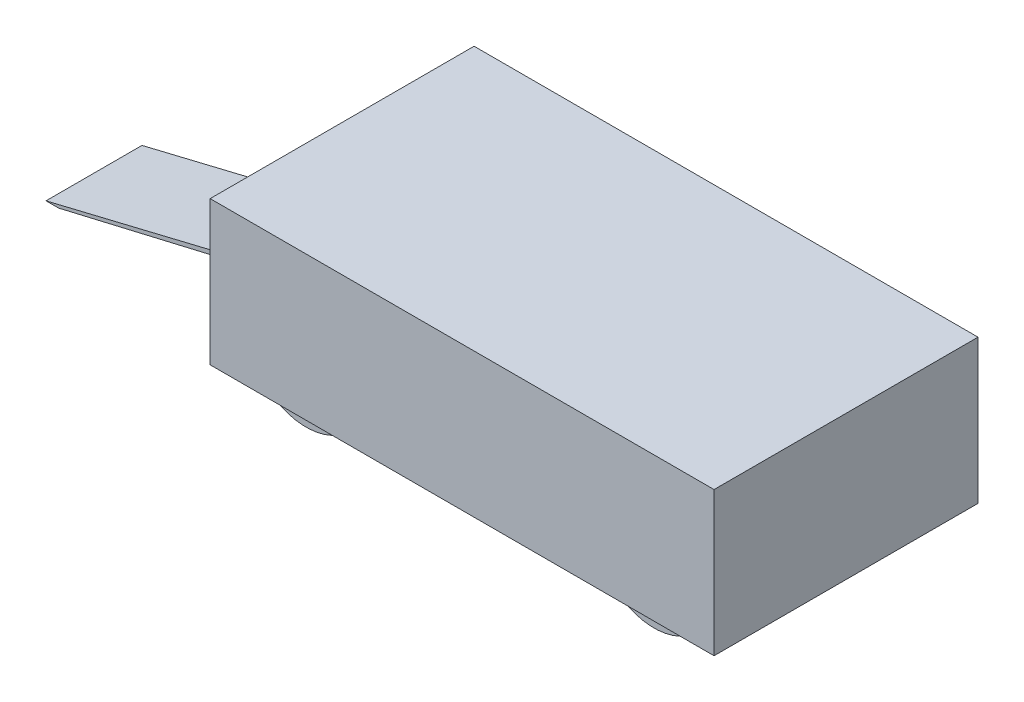
ISO-10303-21;
HEADER;
FILE_DESCRIPTION(('STEP AP214'),'2;1');
FILE_NAME('part.step','',(''),(''),'','','');
FILE_SCHEMA(('AUTOMOTIVE_DESIGN { 1 0 10303 214 1 1 1 1 }'));
ENDSEC;
DATA;
#1=APPLICATION_CONTEXT('core data for automotive mechanical design processes');
#2=APPLICATION_PROTOCOL_DEFINITION('international standard','automotive_design',2000,#1);
#3=PRODUCT_CONTEXT('',#1,'mechanical');
#4=PRODUCT('Part','Part','',(#3));
#5=PRODUCT_RELATED_PRODUCT_CATEGORY('part','',(#4));
#6=PRODUCT_DEFINITION_FORMATION('','',#4);
#7=PRODUCT_DEFINITION_CONTEXT('part definition',#1,'design');
#8=PRODUCT_DEFINITION('design','',#6,#7);
#9=PRODUCT_DEFINITION_SHAPE('','',#8);
#10=(LENGTH_UNIT() NAMED_UNIT(*) SI_UNIT(.MILLI.,.METRE.));
#11=(NAMED_UNIT(*) PLANE_ANGLE_UNIT() SI_UNIT($,.RADIAN.));
#12=(NAMED_UNIT(*) SI_UNIT($,.STERADIAN.) SOLID_ANGLE_UNIT());
#13=UNCERTAINTY_MEASURE_WITH_UNIT(LENGTH_MEASURE(1.E-05),#10,'distance_accuracy_value','');
#14=(GEOMETRIC_REPRESENTATION_CONTEXT(3) GLOBAL_UNCERTAINTY_ASSIGNED_CONTEXT((#13)) GLOBAL_UNIT_ASSIGNED_CONTEXT((#10,
#11,#12)) REPRESENTATION_CONTEXT('',''));
#15=CARTESIAN_POINT('',(0.,0.,0.));
#16=DIRECTION('',(0.,0.,1.));
#17=DIRECTION('',(1.,0.,0.));
#18=AXIS2_PLACEMENT_3D('',#15,#16,#17);
#19=CARTESIAN_POINT('',(0.,0.,0.));
#20=DIRECTION('',(0.,-1.,0.));
#21=DIRECTION('',(0.,0.,-1.));
#22=AXIS2_PLACEMENT_3D('',#19,#20,#21);
#23=PLANE('',#22);
#24=DIRECTION('',(0.,0.,-1.));
#25=VECTOR('',#24,1.);
#26=CARTESIAN_POINT('',(-266.7,0.,139.7));
#27=LINE('',#26,#25);
#28=CARTESIAN_POINT('',(-266.7,0.,139.7));
#29=VERTEX_POINT('',#28);
#30=CARTESIAN_POINT('',(-266.7,0.,-139.7));
#31=VERTEX_POINT('',#30);
#32=EDGE_CURVE('E256',#29,#31,#27,.T.);
#33=ORIENTED_EDGE('',*,*,#32,.T.);
#34=DIRECTION('',(1.,0.,0.));
#35=VECTOR('',#34,1.);
#36=CARTESIAN_POINT('',(-266.7,0.,-139.7));
#37=LINE('',#36,#35);
#38=CARTESIAN_POINT('',(266.7,0.,-139.7));
#39=VERTEX_POINT('',#38);
#40=EDGE_CURVE('E271',#31,#39,#37,.T.);
#41=ORIENTED_EDGE('',*,*,#40,.T.);
#42=DIRECTION('',(0.,0.,-1.));
#43=VECTOR('',#42,1.);
#44=CARTESIAN_POINT('',(266.7,0.,139.7));
#45=LINE('',#44,#43);
#46=CARTESIAN_POINT('',(266.7,0.,139.7));
#47=VERTEX_POINT('',#46);
#48=EDGE_CURVE('E274',#47,#39,#45,.T.);
#49=ORIENTED_EDGE('',*,*,#48,.F.);
#50=DIRECTION('',(1.,0.,0.));
#51=VECTOR('',#50,1.);
#52=CARTESIAN_POINT('',(-266.7,0.,139.7));
#53=LINE('',#52,#51);
#54=EDGE_CURVE('E261',#29,#47,#53,.T.);
#55=ORIENTED_EDGE('',*,*,#54,.F.);
#56=EDGE_LOOP('',(#33,#41,#49,#55));
#57=FACE_BOUND('',#56,.T.);
#58=DIRECTION('',(0.,0.,-1.));
#59=VECTOR('',#58,1.);
#60=CARTESIAN_POINT('',(-234.95,0.,69.85));
#61=LINE('',#60,#59);
#62=CARTESIAN_POINT('',(-234.95,0.,69.85));
#63=VERTEX_POINT('',#62);
#64=CARTESIAN_POINT('',(-234.95,0.,120.65));
#65=VERTEX_POINT('',#64);
#66=EDGE_CURVE('E292',#63,#65,#61,.F.);
#67=ORIENTED_EDGE('',*,*,#66,.T.);
#68=DIRECTION('',(1.,0.,0.));
#69=VECTOR('',#68,1.);
#70=CARTESIAN_POINT('',(0.,0.,120.65));
#71=LINE('',#70,#69);
#72=CARTESIAN_POINT('',(-133.35,0.,120.65));
#73=VERTEX_POINT('',#72);
#74=EDGE_CURVE('E295',#65,#73,#71,.T.);
#75=ORIENTED_EDGE('',*,*,#74,.T.);
#76=DIRECTION('',(0.,0.,-1.));
#77=VECTOR('',#76,1.);
#78=CARTESIAN_POINT('',(-133.35,0.,69.85));
#79=LINE('',#78,#77);
#80=CARTESIAN_POINT('',(-133.35,0.,69.8500000000001));
#81=VERTEX_POINT('',#80);
#82=EDGE_CURVE('E289',#73,#81,#79,.T.);
#83=ORIENTED_EDGE('',*,*,#82,.T.);
#84=DIRECTION('',(-1.,0.,0.));
#85=VECTOR('',#84,1.);
#86=CARTESIAN_POINT('',(0.,0.,69.8500000000001));
#87=LINE('',#86,#85);
#88=EDGE_CURVE('E280',#81,#63,#87,.T.);
#89=ORIENTED_EDGE('',*,*,#88,.T.);
#90=EDGE_LOOP('',(#67,#75,#83,#89));
#91=FACE_BOUND('',#90,.T.);
#92=DIRECTION('',(0.,0.,1.));
#93=VECTOR('',#92,1.);
#94=CARTESIAN_POINT('',(-133.35,0.,-69.85));
#95=LINE('',#94,#93);
#96=CARTESIAN_POINT('',(-133.35,0.,-69.8500000000001));
#97=VERTEX_POINT('',#96);
#98=CARTESIAN_POINT('',(-133.35,0.,-120.65));
#99=VERTEX_POINT('',#98);
#100=EDGE_CURVE('E304',#97,#99,#95,.F.);
#101=ORIENTED_EDGE('',*,*,#100,.T.);
#102=DIRECTION('',(-1.,0.,0.));
#103=VECTOR('',#102,1.);
#104=CARTESIAN_POINT('',(0.,0.,-120.65));
#105=LINE('',#104,#103);
#106=CARTESIAN_POINT('',(-234.95,0.,-120.65));
#107=VERTEX_POINT('',#106);
#108=EDGE_CURVE('E307',#99,#107,#105,.T.);
#109=ORIENTED_EDGE('',*,*,#108,.T.);
#110=DIRECTION('',(0.,0.,1.));
#111=VECTOR('',#110,1.);
#112=CARTESIAN_POINT('',(-234.95,0.,-69.85));
#113=LINE('',#112,#111);
#114=CARTESIAN_POINT('',(-234.95,0.,-69.85));
#115=VERTEX_POINT('',#114);
#116=EDGE_CURVE('E301',#107,#115,#113,.T.);
#117=ORIENTED_EDGE('',*,*,#116,.T.);
#118=DIRECTION('',(1.,0.,0.));
#119=VECTOR('',#118,1.);
#120=CARTESIAN_POINT('',(0.,0.,-69.8500000000001));
#121=LINE('',#120,#119);
#122=EDGE_CURVE('E298',#115,#97,#121,.T.);
#123=ORIENTED_EDGE('',*,*,#122,.T.);
#124=EDGE_LOOP('',(#101,#109,#117,#123));
#125=FACE_BOUND('',#124,.T.);
#126=DIRECTION('',(0.,0.,-1.));
#127=VECTOR('',#126,1.);
#128=CARTESIAN_POINT('',(133.35,0.,69.85));
#129=LINE('',#128,#127);
#130=CARTESIAN_POINT('',(133.35,0.,69.8500000000001));
#131=VERTEX_POINT('',#130);
#132=CARTESIAN_POINT('',(133.35,0.,120.65));
#133=VERTEX_POINT('',#132);
#134=EDGE_CURVE('E316',#131,#133,#129,.F.);
#135=ORIENTED_EDGE('',*,*,#134,.T.);
#136=DIRECTION('',(1.,0.,0.));
#137=VECTOR('',#136,1.);
#138=CARTESIAN_POINT('',(0.,0.,120.65));
#139=LINE('',#138,#137);
#140=CARTESIAN_POINT('',(234.95,0.,120.65));
#141=VERTEX_POINT('',#140);
#142=EDGE_CURVE('E319',#133,#141,#139,.T.);
#143=ORIENTED_EDGE('',*,*,#142,.T.);
#144=DIRECTION('',(0.,0.,-1.));
#145=VECTOR('',#144,1.);
#146=CARTESIAN_POINT('',(234.95,0.,69.85));
#147=LINE('',#146,#145);
#148=CARTESIAN_POINT('',(234.95,0.,69.85));
#149=VERTEX_POINT('',#148);
#150=EDGE_CURVE('E313',#141,#149,#147,.T.);
#151=ORIENTED_EDGE('',*,*,#150,.T.);
#152=DIRECTION('',(-1.,0.,0.));
#153=VECTOR('',#152,1.);
#154=CARTESIAN_POINT('',(0.,0.,69.8500000000001));
#155=LINE('',#154,#153);
#156=EDGE_CURVE('E310',#149,#131,#155,.T.);
#157=ORIENTED_EDGE('',*,*,#156,.T.);
#158=EDGE_LOOP('',(#135,#143,#151,#157));
#159=FACE_BOUND('',#158,.T.);
#160=DIRECTION('',(0.,0.,1.));
#161=VECTOR('',#160,1.);
#162=CARTESIAN_POINT('',(234.95,0.,-69.85));
#163=LINE('',#162,#161);
#164=CARTESIAN_POINT('',(234.95,0.,-69.85));
#165=VERTEX_POINT('',#164);
#166=CARTESIAN_POINT('',(234.95,0.,-120.65));
#167=VERTEX_POINT('',#166);
#168=EDGE_CURVE('E43',#165,#167,#163,.F.);
#169=ORIENTED_EDGE('',*,*,#168,.T.);
#170=DIRECTION('',(-1.,0.,0.));
#171=VECTOR('',#170,1.);
#172=CARTESIAN_POINT('',(0.,0.,-120.65));
#173=LINE('',#172,#171);
#174=CARTESIAN_POINT('',(133.35,0.,-120.65));
#175=VERTEX_POINT('',#174);
#176=EDGE_CURVE('E11',#167,#175,#173,.T.);
#177=ORIENTED_EDGE('',*,*,#176,.T.);
#178=DIRECTION('',(0.,0.,1.));
#179=VECTOR('',#178,1.);
#180=CARTESIAN_POINT('',(133.35,0.,-69.85));
#181=LINE('',#180,#179);
#182=CARTESIAN_POINT('',(133.35,0.,-69.8500000000001));
#183=VERTEX_POINT('',#182);
#184=EDGE_CURVE('E325',#175,#183,#181,.T.);
#185=ORIENTED_EDGE('',*,*,#184,.T.);
#186=DIRECTION('',(1.,0.,0.));
#187=VECTOR('',#186,1.);
#188=CARTESIAN_POINT('',(0.,0.,-69.8500000000001));
#189=LINE('',#188,#187);
#190=EDGE_CURVE('E322',#183,#165,#189,.T.);
#191=ORIENTED_EDGE('',*,*,#190,.T.);
#192=EDGE_LOOP('',(#169,#177,#185,#191));
#193=FACE_BOUND('',#192,.T.);
#194=ADVANCED_FACE('F35',(#57,#91,#125,#159,#193),#23,.T.);
#195=CARTESIAN_POINT('',(-266.7,152.4,139.7));
#196=DIRECTION('',(-1.,0.,0.));
#197=DIRECTION('',(0.,0.,1.));
#198=AXIS2_PLACEMENT_3D('',#195,#196,#197);
#199=PLANE('',#198);
#200=DIRECTION('',(0.,1.,0.));
#201=VECTOR('',#200,1.);
#202=CARTESIAN_POINT('',(-266.7,38.0999999999999,50.8));
#203=LINE('',#202,#201);
#204=CARTESIAN_POINT('',(-266.7,33.0275586430844,50.8));
#205=VERTEX_POINT('',#204);
#206=CARTESIAN_POINT('',(-266.7,38.1,50.8));
#207=VERTEX_POINT('',#206);
#208=EDGE_CURVE('E186',#205,#207,#203,.T.);
#209=ORIENTED_EDGE('',*,*,#208,.F.);
#210=DIRECTION('',(0.,0.,-1.));
#211=VECTOR('',#210,1.);
#212=CARTESIAN_POINT('',(-266.7,33.0275586430844,321.026242280529));
#213=LINE('',#212,#211);
#214=CARTESIAN_POINT('',(-266.7,33.0275586430844,-50.8));
#215=VERTEX_POINT('',#214);
#216=EDGE_CURVE('E182',#205,#215,#213,.T.);
#217=ORIENTED_EDGE('',*,*,#216,.T.);
#218=DIRECTION('',(0.,1.,0.));
#219=VECTOR('',#218,1.);
#220=CARTESIAN_POINT('',(-266.7,38.1,-50.8));
#221=LINE('',#220,#219);
#222=CARTESIAN_POINT('',(-266.7,38.1,-50.8));
#223=VERTEX_POINT('',#222);
#224=EDGE_CURVE('E198',#215,#223,#221,.T.);
#225=ORIENTED_EDGE('',*,*,#224,.T.);
#226=DIRECTION('',(0.,-1.,0.));
#227=VECTOR('',#226,1.);
#228=CARTESIAN_POINT('',(-266.7,50.8,-50.8));
#229=LINE('',#228,#227);
#230=CARTESIAN_POINT('',(-266.7,50.8,-50.8));
#231=VERTEX_POINT('',#230);
#232=EDGE_CURVE('E191',#231,#223,#229,.T.);
#233=ORIENTED_EDGE('',*,*,#232,.F.);
#234=DIRECTION('',(0.,0.,-1.));
#235=VECTOR('',#234,1.);
#236=CARTESIAN_POINT('',(-266.7,50.8,-50.8));
#237=LINE('',#236,#235);
#238=CARTESIAN_POINT('',(-266.7,50.8,50.8));
#239=VERTEX_POINT('',#238);
#240=EDGE_CURVE('E209',#239,#231,#237,.T.);
#241=ORIENTED_EDGE('',*,*,#240,.F.);
#242=DIRECTION('',(0.,1.,0.));
#243=VECTOR('',#242,1.);
#244=CARTESIAN_POINT('',(-266.7,50.8,50.8));
#245=LINE('',#244,#243);
#246=EDGE_CURVE('E221',#207,#239,#245,.T.);
#247=ORIENTED_EDGE('',*,*,#246,.F.);
#248=EDGE_LOOP('',(#209,#217,#225,#233,#241,#247));
#249=FACE_BOUND('',#248,.T.);
#250=ORIENTED_EDGE('',*,*,#32,.F.);
#251=DIRECTION('',(0.,-1.,0.));
#252=VECTOR('',#251,1.);
#253=CARTESIAN_POINT('',(-266.7,152.4,139.7));
#254=LINE('',#253,#252);
#255=CARTESIAN_POINT('',(-266.7,152.4,139.7));
#256=VERTEX_POINT('',#255);
#257=EDGE_CURVE('E278',#256,#29,#254,.T.);
#258=ORIENTED_EDGE('',*,*,#257,.F.);
#259=DIRECTION('',(0.,0.,-1.));
#260=VECTOR('',#259,1.);
#261=CARTESIAN_POINT('',(-266.7,152.4,139.7));
#262=LINE('',#261,#260);
#263=CARTESIAN_POINT('',(-266.7,152.4,-139.7));
#264=VERTEX_POINT('',#263);
#265=EDGE_CURVE('E257',#256,#264,#262,.T.);
#266=ORIENTED_EDGE('',*,*,#265,.T.);
#267=DIRECTION('',(0.,-1.,0.));
#268=VECTOR('',#267,1.);
#269=CARTESIAN_POINT('',(-266.7,152.4,-139.7));
#270=LINE('',#269,#268);
#271=EDGE_CURVE('E268',#264,#31,#270,.T.);
#272=ORIENTED_EDGE('',*,*,#271,.T.);
#273=EDGE_LOOP('',(#250,#258,#266,#272));
#274=FACE_BOUND('',#273,.T.);
#275=ADVANCED_FACE('F37',(#249,#274),#199,.T.);
#276=CARTESIAN_POINT('',(-266.7,152.4,139.7));
#277=DIRECTION('',(0.,0.,-1.));
#278=DIRECTION('',(-1.,0.,0.));
#279=AXIS2_PLACEMENT_3D('',#276,#277,#278);
#280=PLANE('',#279);
#281=ORIENTED_EDGE('',*,*,#54,.T.);
#282=DIRECTION('',(0.,-1.,0.));
#283=VECTOR('',#282,1.);
#284=CARTESIAN_POINT('',(266.7,152.4,139.7));
#285=LINE('',#284,#283);
#286=CARTESIAN_POINT('',(266.7,152.4,139.7));
#287=VERTEX_POINT('',#286);
#288=EDGE_CURVE('E281',#287,#47,#285,.T.);
#289=ORIENTED_EDGE('',*,*,#288,.F.);
#290=DIRECTION('',(1.,0.,0.));
#291=VECTOR('',#290,1.);
#292=CARTESIAN_POINT('',(-266.7,152.4,139.7));
#293=LINE('',#292,#291);
#294=EDGE_CURVE('E266',#256,#287,#293,.T.);
#295=ORIENTED_EDGE('',*,*,#294,.F.);
#296=ORIENTED_EDGE('',*,*,#257,.T.);
#297=EDGE_LOOP('',(#281,#289,#295,#296));
#298=FACE_BOUND('',#297,.T.);
#299=ADVANCED_FACE('F352',(#298),#280,.F.);
#300=CARTESIAN_POINT('',(266.7,152.4,139.7));
#301=DIRECTION('',(-1.,0.,0.));
#302=DIRECTION('',(0.,0.,1.));
#303=AXIS2_PLACEMENT_3D('',#300,#301,#302);
#304=PLANE('',#303);
#305=ORIENTED_EDGE('',*,*,#48,.T.);
#306=DIRECTION('',(0.,-1.,0.));
#307=VECTOR('',#306,1.);
#308=CARTESIAN_POINT('',(266.7,152.4,-139.7));
#309=LINE('',#308,#307);
#310=CARTESIAN_POINT('',(266.7,152.4,-139.7));
#311=VERTEX_POINT('',#310);
#312=EDGE_CURVE('E284',#311,#39,#309,.T.);
#313=ORIENTED_EDGE('',*,*,#312,.F.);
#314=DIRECTION('',(0.,0.,-1.));
#315=VECTOR('',#314,1.);
#316=CARTESIAN_POINT('',(266.7,152.4,139.7));
#317=LINE('',#316,#315);
#318=EDGE_CURVE('E264',#287,#311,#317,.T.);
#319=ORIENTED_EDGE('',*,*,#318,.F.);
#320=ORIENTED_EDGE('',*,*,#288,.T.);
#321=EDGE_LOOP('',(#305,#313,#319,#320));
#322=FACE_BOUND('',#321,.T.);
#323=ADVANCED_FACE('F361',(#322),#304,.F.);
#324=CARTESIAN_POINT('',(-266.7,152.4,-139.7));
#325=DIRECTION('',(0.,0.,-1.));
#326=DIRECTION('',(-1.,0.,0.));
#327=AXIS2_PLACEMENT_3D('',#324,#325,#326);
#328=PLANE('',#327);
#329=ORIENTED_EDGE('',*,*,#40,.F.);
#330=ORIENTED_EDGE('',*,*,#271,.F.);
#331=DIRECTION('',(1.,0.,0.));
#332=VECTOR('',#331,1.);
#333=CARTESIAN_POINT('',(-266.7,152.4,-139.7));
#334=LINE('',#333,#332);
#335=EDGE_CURVE('E260',#264,#311,#334,.T.);
#336=ORIENTED_EDGE('',*,*,#335,.T.);
#337=ORIENTED_EDGE('',*,*,#312,.T.);
#338=EDGE_LOOP('',(#329,#330,#336,#337));
#339=FACE_BOUND('',#338,.T.);
#340=ADVANCED_FACE('F364',(#339),#328,.T.);
#341=CARTESIAN_POINT('',(0.,152.4,0.));
#342=DIRECTION('',(0.,-1.,0.));
#343=DIRECTION('',(0.,0.,-1.));
#344=AXIS2_PLACEMENT_3D('',#341,#342,#343);
#345=PLANE('',#344);
#346=ORIENTED_EDGE('',*,*,#265,.F.);
#347=ORIENTED_EDGE('',*,*,#294,.T.);
#348=ORIENTED_EDGE('',*,*,#318,.T.);
#349=ORIENTED_EDGE('',*,*,#335,.F.);
#350=EDGE_LOOP('',(#346,#347,#348,#349));
#351=FACE_BOUND('',#350,.T.);
#352=ADVANCED_FACE('F357',(#351),#345,.F.);
#353=CARTESIAN_POINT('',(-184.15,38.1,69.85));
#354=DIRECTION('',(0.,0.,-1.));
#355=DIRECTION('',(-1.,0.,0.));
#356=AXIS2_PLACEMENT_3D('',#353,#354,#355);
#357=CYLINDRICAL_SURFACE('',#356,63.5);
#358=ORIENTED_EDGE('',*,*,#66,.F.);
#359=CARTESIAN_POINT('',(-184.15,38.1,69.85));
#360=DIRECTION('',(0.,0.,-1.));
#361=DIRECTION('',(-1.,0.,0.));
#362=AXIS2_PLACEMENT_3D('',#359,#360,#361);
#363=CIRCLE('',#362,63.5);
#364=EDGE_CURVE('E251',#81,#63,#363,.T.);
#365=ORIENTED_EDGE('',*,*,#364,.F.);
#366=ORIENTED_EDGE('',*,*,#82,.F.);
#367=CARTESIAN_POINT('',(-184.15,38.1,120.65));
#368=DIRECTION('',(0.,0.,-1.));
#369=DIRECTION('',(-1.,0.,0.));
#370=AXIS2_PLACEMENT_3D('',#367,#368,#369);
#371=CIRCLE('',#370,63.5);
#372=EDGE_CURVE('E253',#73,#65,#371,.T.);
#373=ORIENTED_EDGE('',*,*,#372,.T.);
#374=EDGE_LOOP('',(#358,#365,#366,#373));
#375=FACE_BOUND('',#374,.T.);
#376=ADVANCED_FACE('F371',(#375),#357,.T.);
#377=CARTESIAN_POINT('',(-247.65,38.1,120.65));
#378=DIRECTION('',(0.,0.,-1.));
#379=DIRECTION('',(-1.,0.,0.));
#380=AXIS2_PLACEMENT_3D('',#377,#378,#379);
#381=PLANE('',#380);
#382=ORIENTED_EDGE('',*,*,#74,.F.);
#383=ORIENTED_EDGE('',*,*,#372,.F.);
#384=EDGE_LOOP('',(#382,#383));
#385=FACE_BOUND('',#384,.T.);
#386=ADVANCED_FACE('F388',(#385),#381,.F.);
#387=CARTESIAN_POINT('',(-247.65,38.1,69.85));
#388=DIRECTION('',(0.,0.,1.));
#389=DIRECTION('',(1.,0.,0.));
#390=AXIS2_PLACEMENT_3D('',#387,#388,#389);
#391=PLANE('',#390);
#392=ORIENTED_EDGE('',*,*,#88,.F.);
#393=ORIENTED_EDGE('',*,*,#364,.T.);
#394=EDGE_LOOP('',(#392,#393));
#395=FACE_BOUND('',#394,.T.);
#396=ADVANCED_FACE('F392',(#395),#391,.F.);
#397=CARTESIAN_POINT('',(-184.15,38.1,-69.85));
#398=DIRECTION('',(0.,0.,1.));
#399=DIRECTION('',(-1.,0.,0.));
#400=AXIS2_PLACEMENT_3D('',#397,#398,#399);
#401=CYLINDRICAL_SURFACE('',#400,63.5);
#402=ORIENTED_EDGE('',*,*,#100,.F.);
#403=CARTESIAN_POINT('',(-184.15,38.1,-69.85));
#404=DIRECTION('',(0.,0.,-1.));
#405=DIRECTION('',(-1.,0.,0.));
#406=AXIS2_PLACEMENT_3D('',#403,#404,#405);
#407=CIRCLE('',#406,63.5);
#408=EDGE_CURVE('E245',#97,#115,#407,.T.);
#409=ORIENTED_EDGE('',*,*,#408,.T.);
#410=ORIENTED_EDGE('',*,*,#116,.F.);
#411=CARTESIAN_POINT('',(-184.15,38.1,-120.65));
#412=DIRECTION('',(0.,0.,-1.));
#413=DIRECTION('',(-1.,0.,0.));
#414=AXIS2_PLACEMENT_3D('',#411,#412,#413);
#415=CIRCLE('',#414,63.5);
#416=EDGE_CURVE('E248',#99,#107,#415,.T.);
#417=ORIENTED_EDGE('',*,*,#416,.F.);
#418=EDGE_LOOP('',(#402,#409,#410,#417));
#419=FACE_BOUND('',#418,.T.);
#420=ADVANCED_FACE('F399',(#419),#401,.T.);
#421=CARTESIAN_POINT('',(-247.65,38.1,-120.65));
#422=DIRECTION('',(0.,0.,1.));
#423=DIRECTION('',(-1.,0.,0.));
#424=AXIS2_PLACEMENT_3D('',#421,#422,#423);
#425=PLANE('',#424);
#426=ORIENTED_EDGE('',*,*,#108,.F.);
#427=ORIENTED_EDGE('',*,*,#416,.T.);
#428=EDGE_LOOP('',(#426,#427));
#429=FACE_BOUND('',#428,.T.);
#430=ADVANCED_FACE('F403',(#429),#425,.F.);
#431=CARTESIAN_POINT('',(-247.65,38.1,-69.85));
#432=DIRECTION('',(0.,0.,-1.));
#433=DIRECTION('',(1.,0.,0.));
#434=AXIS2_PLACEMENT_3D('',#431,#432,#433);
#435=PLANE('',#434);
#436=ORIENTED_EDGE('',*,*,#122,.F.);
#437=ORIENTED_EDGE('',*,*,#408,.F.);
#438=EDGE_LOOP('',(#436,#437));
#439=FACE_BOUND('',#438,.T.);
#440=ADVANCED_FACE('F407',(#439),#435,.F.);
#441=CARTESIAN_POINT('',(184.15,38.1,69.85));
#442=DIRECTION('',(0.,0.,-1.));
#443=DIRECTION('',(1.,0.,0.));
#444=AXIS2_PLACEMENT_3D('',#441,#442,#443);
#445=CYLINDRICAL_SURFACE('',#444,63.5);
#446=ORIENTED_EDGE('',*,*,#134,.F.);
#447=CARTESIAN_POINT('',(184.15,38.1,69.85));
#448=DIRECTION('',(0.,0.,1.));
#449=DIRECTION('',(1.,0.,0.));
#450=AXIS2_PLACEMENT_3D('',#447,#448,#449);
#451=CIRCLE('',#450,63.5);
#452=EDGE_CURVE('E239',#131,#149,#451,.T.);
#453=ORIENTED_EDGE('',*,*,#452,.T.);
#454=ORIENTED_EDGE('',*,*,#150,.F.);
#455=CARTESIAN_POINT('',(184.15,38.1,120.65));
#456=DIRECTION('',(0.,0.,1.));
#457=DIRECTION('',(1.,0.,0.));
#458=AXIS2_PLACEMENT_3D('',#455,#456,#457);
#459=CIRCLE('',#458,63.5);
#460=EDGE_CURVE('E242',#133,#141,#459,.T.);
#461=ORIENTED_EDGE('',*,*,#460,.F.);
#462=EDGE_LOOP('',(#446,#453,#454,#461));
#463=FACE_BOUND('',#462,.T.);
#464=ADVANCED_FACE('F411',(#463),#445,.T.);
#465=CARTESIAN_POINT('',(247.65,38.1,120.65));
#466=DIRECTION('',(0.,0.,-1.));
#467=DIRECTION('',(1.,0.,0.));
#468=AXIS2_PLACEMENT_3D('',#465,#466,#467);
#469=PLANE('',#468);
#470=ORIENTED_EDGE('',*,*,#142,.F.);
#471=ORIENTED_EDGE('',*,*,#460,.T.);
#472=EDGE_LOOP('',(#470,#471));
#473=FACE_BOUND('',#472,.T.);
#474=ADVANCED_FACE('F415',(#473),#469,.F.);
#475=CARTESIAN_POINT('',(247.65,38.1,69.85));
#476=DIRECTION('',(0.,0.,1.));
#477=DIRECTION('',(-1.,0.,0.));
#478=AXIS2_PLACEMENT_3D('',#475,#476,#477);
#479=PLANE('',#478);
#480=ORIENTED_EDGE('',*,*,#156,.F.);
#481=ORIENTED_EDGE('',*,*,#452,.F.);
#482=EDGE_LOOP('',(#480,#481));
#483=FACE_BOUND('',#482,.T.);
#484=ADVANCED_FACE('F343',(#483),#479,.F.);
#485=CARTESIAN_POINT('',(184.15,38.1,-69.85));
#486=DIRECTION('',(0.,0.,1.));
#487=DIRECTION('',(1.,0.,0.));
#488=AXIS2_PLACEMENT_3D('',#485,#486,#487);
#489=CYLINDRICAL_SURFACE('',#488,63.5);
#490=ORIENTED_EDGE('',*,*,#168,.F.);
#491=CARTESIAN_POINT('',(184.15,38.1,-69.85));
#492=DIRECTION('',(0.,0.,1.));
#493=DIRECTION('',(1.,0.,0.));
#494=AXIS2_PLACEMENT_3D('',#491,#492,#493);
#495=CIRCLE('',#494,63.5);
#496=EDGE_CURVE('E57',#183,#165,#495,.T.);
#497=ORIENTED_EDGE('',*,*,#496,.F.);
#498=ORIENTED_EDGE('',*,*,#184,.F.);
#499=CARTESIAN_POINT('',(184.15,38.1,-120.65));
#500=DIRECTION('',(0.,0.,1.));
#501=DIRECTION('',(1.,0.,0.));
#502=AXIS2_PLACEMENT_3D('',#499,#500,#501);
#503=CIRCLE('',#502,63.5);
#504=EDGE_CURVE('E236',#175,#167,#503,.T.);
#505=ORIENTED_EDGE('',*,*,#504,.T.);
#506=EDGE_LOOP('',(#490,#497,#498,#505));
#507=FACE_BOUND('',#506,.T.);
#508=ADVANCED_FACE('F330',(#507),#489,.T.);
#509=CARTESIAN_POINT('',(247.65,38.1,-120.65));
#510=DIRECTION('',(0.,0.,1.));
#511=DIRECTION('',(1.,0.,0.));
#512=AXIS2_PLACEMENT_3D('',#509,#510,#511);
#513=PLANE('',#512);
#514=ORIENTED_EDGE('',*,*,#176,.F.);
#515=ORIENTED_EDGE('',*,*,#504,.F.);
#516=EDGE_LOOP('',(#514,#515));
#517=FACE_BOUND('',#516,.T.);
#518=ADVANCED_FACE('F333',(#517),#513,.F.);
#519=CARTESIAN_POINT('',(247.65,38.1,-69.85));
#520=DIRECTION('',(0.,0.,-1.));
#521=DIRECTION('',(-1.,0.,0.));
#522=AXIS2_PLACEMENT_3D('',#519,#520,#521);
#523=PLANE('',#522);
#524=ORIENTED_EDGE('',*,*,#190,.F.);
#525=ORIENTED_EDGE('',*,*,#496,.T.);
#526=EDGE_LOOP('',(#524,#525));
#527=FACE_BOUND('',#526,.T.);
#528=ADVANCED_FACE('F335',(#527),#523,.F.);
#529=CARTESIAN_POINT('',(-25.4000000000001,50.8,-50.8));
#530=DIRECTION('',(0.,0.,-1.));
#531=DIRECTION('',(-1.,0.,0.));
#532=AXIS2_PLACEMENT_3D('',#529,#530,#531);
#533=PLANE('',#532);
#534=ORIENTED_EDGE('',*,*,#232,.T.);
#535=DIRECTION('',(-1.,0.,0.));
#536=VECTOR('',#535,1.);
#537=CARTESIAN_POINT('',(-25.4000000000001,38.1,-50.8));
#538=LINE('',#537,#536);
#539=CARTESIAN_POINT('',(-25.4000000000001,38.1,-50.8));
#540=VERTEX_POINT('',#539);
#541=EDGE_CURVE('E217',#540,#223,#538,.T.);
#542=ORIENTED_EDGE('',*,*,#541,.F.);
#543=DIRECTION('',(0.,-1.,0.));
#544=VECTOR('',#543,1.);
#545=CARTESIAN_POINT('',(-25.4000000000001,50.8,-50.8));
#546=LINE('',#545,#544);
#547=CARTESIAN_POINT('',(-25.4000000000001,50.8,-50.8));
#548=VERTEX_POINT('',#547);
#549=EDGE_CURVE('E205',#548,#540,#546,.T.);
#550=ORIENTED_EDGE('',*,*,#549,.F.);
#551=DIRECTION('',(-1.,0.,0.));
#552=VECTOR('',#551,1.);
#553=CARTESIAN_POINT('',(-25.4000000000001,50.8,-50.8));
#554=LINE('',#553,#552);
#555=EDGE_CURVE('E226',#548,#231,#554,.T.);
#556=ORIENTED_EDGE('',*,*,#555,.T.);
#557=EDGE_LOOP('',(#534,#542,#550,#556));
#558=FACE_BOUND('',#557,.T.);
#559=ADVANCED_FACE('F341',(#558),#533,.F.);
#560=CARTESIAN_POINT('',(-25.4000000000001,50.8,-50.8));
#561=DIRECTION('',(0.,1.,0.));
#562=DIRECTION('',(0.,0.,1.));
#563=AXIS2_PLACEMENT_3D('',#560,#561,#562);
#564=PLANE('',#563);
#565=ORIENTED_EDGE('',*,*,#240,.T.);
#566=ORIENTED_EDGE('',*,*,#555,.F.);
#567=DIRECTION('',(0.,0.,-1.));
#568=VECTOR('',#567,1.);
#569=CARTESIAN_POINT('',(-25.4000000000001,50.8,-50.8));
#570=LINE('',#569,#568);
#571=CARTESIAN_POINT('',(-25.4000000000001,50.8,50.8));
#572=VERTEX_POINT('',#571);
#573=EDGE_CURVE('E215',#572,#548,#570,.T.);
#574=ORIENTED_EDGE('',*,*,#573,.F.);
#575=DIRECTION('',(-1.,0.,0.));
#576=VECTOR('',#575,1.);
#577=CARTESIAN_POINT('',(-25.4000000000001,50.8,50.8));
#578=LINE('',#577,#576);
#579=EDGE_CURVE('E228',#572,#239,#578,.T.);
#580=ORIENTED_EDGE('',*,*,#579,.T.);
#581=EDGE_LOOP('',(#565,#566,#574,#580));
#582=FACE_BOUND('',#581,.T.);
#583=ADVANCED_FACE('F451',(#582),#564,.F.);
#584=CARTESIAN_POINT('',(-25.4000000000001,50.8,50.8));
#585=DIRECTION('',(0.,0.,1.));
#586=DIRECTION('',(0.,-1.,0.));
#587=AXIS2_PLACEMENT_3D('',#584,#585,#586);
#588=PLANE('',#587);
#589=ORIENTED_EDGE('',*,*,#246,.T.);
#590=ORIENTED_EDGE('',*,*,#579,.F.);
#591=DIRECTION('',(0.,1.,0.));
#592=VECTOR('',#591,1.);
#593=CARTESIAN_POINT('',(-25.4000000000001,50.8,50.8));
#594=LINE('',#593,#592);
#595=CARTESIAN_POINT('',(-25.4000000000001,38.1,50.8));
#596=VERTEX_POINT('',#595);
#597=EDGE_CURVE('E212',#596,#572,#594,.T.);
#598=ORIENTED_EDGE('',*,*,#597,.F.);
#599=DIRECTION('',(-1.,0.,0.));
#600=VECTOR('',#599,1.);
#601=CARTESIAN_POINT('',(-25.4000000000001,38.1,50.8));
#602=LINE('',#601,#600);
#603=EDGE_CURVE('E230',#596,#207,#602,.T.);
#604=ORIENTED_EDGE('',*,*,#603,.T.);
#605=EDGE_LOOP('',(#589,#590,#598,#604));
#606=FACE_BOUND('',#605,.T.);
#607=ADVANCED_FACE('F456',(#606),#588,.F.);
#608=CARTESIAN_POINT('',(-25.4000000000001,38.1,-50.8));
#609=DIRECTION('',(0.,-1.,0.));
#610=DIRECTION('',(0.,0.,-1.));
#611=AXIS2_PLACEMENT_3D('',#608,#609,#610);
#612=PLANE('',#611);
#613=DIRECTION('',(0.,0.,1.));
#614=VECTOR('',#613,1.);
#615=CARTESIAN_POINT('',(-266.7,38.1,-50.8));
#616=LINE('',#615,#614);
#617=EDGE_CURVE('E194',#223,#207,#616,.T.);
#618=ORIENTED_EDGE('',*,*,#617,.T.);
#619=ORIENTED_EDGE('',*,*,#603,.F.);
#620=DIRECTION('',(0.,0.,1.));
#621=VECTOR('',#620,1.);
#622=CARTESIAN_POINT('',(-25.4000000000001,38.1,-50.8));
#623=LINE('',#622,#621);
#624=EDGE_CURVE('E208',#540,#596,#623,.T.);
#625=ORIENTED_EDGE('',*,*,#624,.F.);
#626=ORIENTED_EDGE('',*,*,#541,.T.);
#627=EDGE_LOOP('',(#618,#619,#625,#626));
#628=FACE_BOUND('',#627,.T.);
#629=ADVANCED_FACE('F469',(#628),#612,.F.);
#630=CARTESIAN_POINT('',(-25.4000000000001,0.,0.));
#631=DIRECTION('',(-1.,0.,0.));
#632=DIRECTION('',(0.,0.,1.));
#633=AXIS2_PLACEMENT_3D('',#630,#631,#632);
#634=PLANE('',#633);
#635=ORIENTED_EDGE('',*,*,#549,.T.);
#636=ORIENTED_EDGE('',*,*,#624,.T.);
#637=ORIENTED_EDGE('',*,*,#597,.T.);
#638=ORIENTED_EDGE('',*,*,#573,.T.);
#639=EDGE_LOOP('',(#635,#636,#637,#638));
#640=FACE_BOUND('',#639,.T.);
#641=ADVANCED_FACE('F464',(#640),#634,.T.);
#642=CARTESIAN_POINT('',(-266.7,38.1,321.026242280529));
#643=DIRECTION('',(0.23498828042792,-0.971998203733695,0.));
#644=DIRECTION('',(0.971998203733695,0.23498828042792,0.));
#645=AXIS2_PLACEMENT_3D('',#642,#643,#644);
#646=PLANE('',#645);
#647=DIRECTION('',(-0.971998203733695,-0.23498828042792,0.));
#648=VECTOR('',#647,1.);
#649=CARTESIAN_POINT('',(-266.7,38.1,50.8));
#650=LINE('',#649,#648);
#651=CARTESIAN_POINT('',(-529.359422098381,-25.4000000000001,50.8000000000001));
#652=VERTEX_POINT('',#651);
#653=EDGE_CURVE('E190',#207,#652,#650,.T.);
#654=ORIENTED_EDGE('',*,*,#653,.F.);
#655=ORIENTED_EDGE('',*,*,#617,.F.);
#656=DIRECTION('',(-0.971998203733695,-0.23498828042792,0.));
#657=VECTOR('',#656,1.);
#658=CARTESIAN_POINT('',(-266.7,38.1,-50.8));
#659=LINE('',#658,#657);
#660=CARTESIAN_POINT('',(-529.359422098381,-25.4000000000001,-50.8));
#661=VERTEX_POINT('',#660);
#662=EDGE_CURVE('E50',#223,#661,#659,.T.);
#663=ORIENTED_EDGE('',*,*,#662,.T.);
#664=DIRECTION('',(0.,0.,-1.));
#665=VECTOR('',#664,1.);
#666=CARTESIAN_POINT('',(-529.359422098381,-25.4000000000001,321.026242280529));
#667=LINE('',#666,#665);
#668=EDGE_CURVE('E202',#652,#661,#667,.T.);
#669=ORIENTED_EDGE('',*,*,#668,.F.);
#670=EDGE_LOOP('',(#654,#655,#663,#669));
#671=FACE_BOUND('',#670,.T.);
#672=ADVANCED_FACE('F468',(#671),#646,.F.);
#673=CARTESIAN_POINT('',(-515.991575795255,-25.4000000000001,321.026242280529));
#674=DIRECTION('',(0.,1.,0.));
#675=DIRECTION('',(-1.,0.,0.));
#676=AXIS2_PLACEMENT_3D('',#673,#674,#675);
#677=PLANE('',#676);
#678=DIRECTION('',(1.,0.,0.));
#679=VECTOR('',#678,1.);
#680=CARTESIAN_POINT('',(-515.991575795255,-25.4000000000001,50.8000000000001));
#681=LINE('',#680,#679);
#682=CARTESIAN_POINT('',(-515.991575795255,-25.4000000000001,50.8));
#683=VERTEX_POINT('',#682);
#684=EDGE_CURVE('E171',#652,#683,#681,.T.);
#685=ORIENTED_EDGE('',*,*,#684,.F.);
#686=ORIENTED_EDGE('',*,*,#668,.T.);
#687=DIRECTION('',(1.,0.,0.));
#688=VECTOR('',#687,1.);
#689=CARTESIAN_POINT('',(-515.991575795255,-25.4000000000001,-50.8));
#690=LINE('',#689,#688);
#691=CARTESIAN_POINT('',(-515.991575795255,-25.4000000000001,-50.8));
#692=VERTEX_POINT('',#691);
#693=EDGE_CURVE('E173',#661,#692,#690,.T.);
#694=ORIENTED_EDGE('',*,*,#693,.T.);
#695=DIRECTION('',(0.,0.,-1.));
#696=VECTOR('',#695,1.);
#697=CARTESIAN_POINT('',(-515.991575795255,-25.4000000000001,321.026242280529));
#698=LINE('',#697,#696);
#699=EDGE_CURVE('E167',#683,#692,#698,.T.);
#700=ORIENTED_EDGE('',*,*,#699,.F.);
#701=EDGE_LOOP('',(#685,#686,#694,#700));
#702=FACE_BOUND('',#701,.T.);
#703=ADVANCED_FACE('F169',(#702),#677,.F.);
#704=CARTESIAN_POINT('',(-266.7,33.0275586430844,321.026242280529));
#705=DIRECTION('',(-0.22819075104913,0.973616444569233,0.));
#706=DIRECTION('',(-0.973616444569233,-0.22819075104913,0.));
#707=AXIS2_PLACEMENT_3D('',#704,#705,#706);
#708=PLANE('',#707);
#709=DIRECTION('',(0.973616444569233,0.22819075104913,0.));
#710=VECTOR('',#709,1.);
#711=CARTESIAN_POINT('',(-266.7,33.0275586430844,50.8));
#712=LINE('',#711,#710);
#713=EDGE_CURVE('E179',#683,#205,#712,.T.);
#714=ORIENTED_EDGE('',*,*,#713,.F.);
#715=ORIENTED_EDGE('',*,*,#699,.T.);
#716=DIRECTION('',(0.973616444569233,0.22819075104913,0.));
#717=VECTOR('',#716,1.);
#718=CARTESIAN_POINT('',(-266.7,33.0275586430844,-50.8));
#719=LINE('',#718,#717);
#720=EDGE_CURVE('E176',#692,#215,#719,.T.);
#721=ORIENTED_EDGE('',*,*,#720,.T.);
#722=ORIENTED_EDGE('',*,*,#216,.F.);
#723=EDGE_LOOP('',(#714,#715,#721,#722));
#724=FACE_BOUND('',#723,.T.);
#725=ADVANCED_FACE('F180',(#724),#708,.F.);
#726=CARTESIAN_POINT('',(0.,0.,-50.8));
#727=DIRECTION('',(0.,0.,-1.));
#728=DIRECTION('',(-1.,0.,0.));
#729=AXIS2_PLACEMENT_3D('',#726,#727,#728);
#730=PLANE('',#729);
#731=ORIENTED_EDGE('',*,*,#224,.F.);
#732=ORIENTED_EDGE('',*,*,#720,.F.);
#733=ORIENTED_EDGE('',*,*,#693,.F.);
#734=ORIENTED_EDGE('',*,*,#662,.F.);
#735=EDGE_LOOP('',(#731,#732,#733,#734));
#736=FACE_BOUND('',#735,.T.);
#737=ADVANCED_FACE('F517',(#736),#730,.T.);
#738=CARTESIAN_POINT('',(-25.4000000000001,50.8,50.8));
#739=DIRECTION('',(0.,0.,1.));
#740=DIRECTION('',(0.,-1.,0.));
#741=AXIS2_PLACEMENT_3D('',#738,#739,#740);
#742=PLANE('',#741);
#743=ORIENTED_EDGE('',*,*,#713,.T.);
#744=ORIENTED_EDGE('',*,*,#208,.T.);
#745=ORIENTED_EDGE('',*,*,#653,.T.);
#746=ORIENTED_EDGE('',*,*,#684,.T.);
#747=EDGE_LOOP('',(#743,#744,#745,#746));
#748=FACE_BOUND('',#747,.T.);
#749=ADVANCED_FACE('F189',(#748),#742,.T.);
#750=CLOSED_SHELL('',(#194,#275,#299,#323,#340,#352,#376,#386,#396,#420,#430,#440,#464,#474,
#484,#508,#518,#528,#559,#583,#607,#629,#641,#672,#703,#725,#737,#749));
#751=MANIFOLD_SOLID_BREP('B2',#750);
#752=ADVANCED_BREP_SHAPE_REPRESENTATION('',(#18,#751),#14);
#753=SHAPE_DEFINITION_REPRESENTATION(#9,#752);
ENDSEC;
END-ISO-10303-21;
